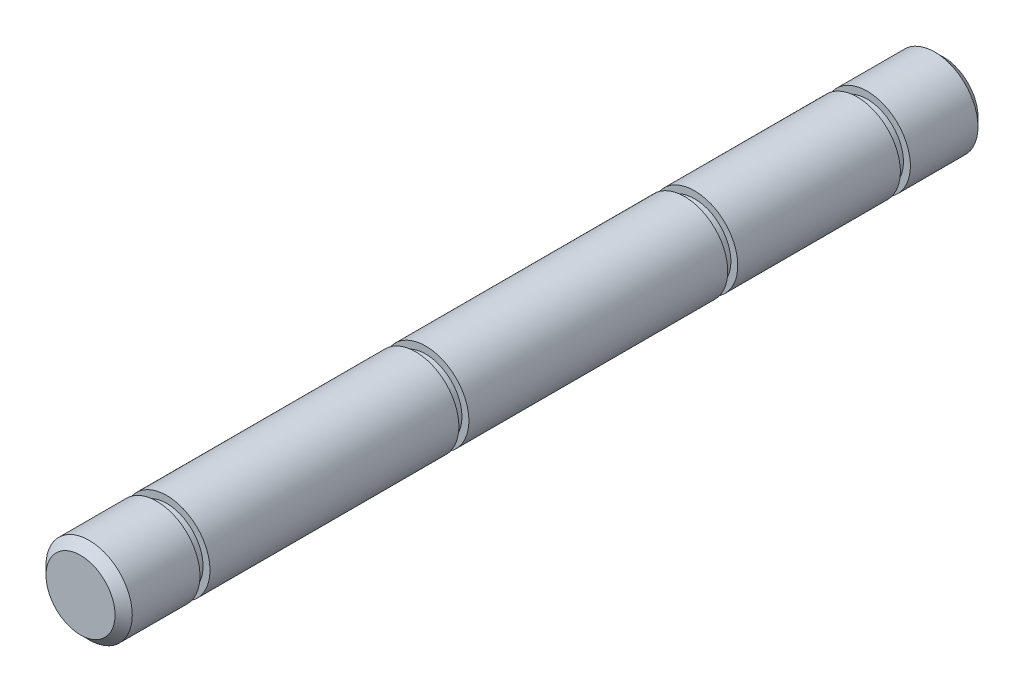
ISO-10303-21;
HEADER;
FILE_DESCRIPTION(('STEP AP214'),'2;1');
FILE_NAME('part.step','',(''),(''),'','','');
FILE_SCHEMA(('AUTOMOTIVE_DESIGN { 1 0 10303 214 1 1 1 1 }'));
ENDSEC;
DATA;
#1=APPLICATION_CONTEXT('core data for automotive mechanical design processes');
#2=APPLICATION_PROTOCOL_DEFINITION('international standard','automotive_design',2000,#1);
#3=PRODUCT_CONTEXT('',#1,'mechanical');
#4=PRODUCT('Part','Part','',(#3));
#5=PRODUCT_RELATED_PRODUCT_CATEGORY('part','',(#4));
#6=PRODUCT_DEFINITION_FORMATION('','',#4);
#7=PRODUCT_DEFINITION_CONTEXT('part definition',#1,'design');
#8=PRODUCT_DEFINITION('design','',#6,#7);
#9=PRODUCT_DEFINITION_SHAPE('','',#8);
#10=(LENGTH_UNIT() NAMED_UNIT(*) SI_UNIT(.MILLI.,.METRE.));
#11=(NAMED_UNIT(*) PLANE_ANGLE_UNIT() SI_UNIT($,.RADIAN.));
#12=(NAMED_UNIT(*) SI_UNIT($,.STERADIAN.) SOLID_ANGLE_UNIT());
#13=UNCERTAINTY_MEASURE_WITH_UNIT(LENGTH_MEASURE(1.E-05),#10,'distance_accuracy_value','');
#14=(GEOMETRIC_REPRESENTATION_CONTEXT(3) GLOBAL_UNCERTAINTY_ASSIGNED_CONTEXT((#13)) GLOBAL_UNIT_ASSIGNED_CONTEXT((#10,
#11,#12)) REPRESENTATION_CONTEXT('',''));
#15=CARTESIAN_POINT('',(0.,0.,0.));
#16=DIRECTION('',(0.,0.,1.));
#17=DIRECTION('',(1.,0.,0.));
#18=AXIS2_PLACEMENT_3D('',#15,#16,#17);
#19=CARTESIAN_POINT('',(0.,0.,63.5));
#20=DIRECTION('',(0.,0.,-1.));
#21=DIRECTION('',(-1.,0.,0.));
#22=AXIS2_PLACEMENT_3D('',#19,#20,#21);
#23=CYLINDRICAL_SURFACE('',#22,3.175);
#24=CARTESIAN_POINT('',(0.,0.,38.1));
#25=DIRECTION('',(0.,0.,-1.));
#26=DIRECTION('',(-1.,0.,0.));
#27=AXIS2_PLACEMENT_3D('',#24,#25,#26);
#28=CIRCLE('',#27,3.175);
#29=CARTESIAN_POINT('',(-3.175,0.,38.1));
#30=VERTEX_POINT('',#29);
#31=EDGE_CURVE('E95',#30,#30,#28,.T.);
#32=ORIENTED_EDGE('',*,*,#31,.T.);
#33=EDGE_LOOP('',(#32));
#34=FACE_BOUND('',#33,.T.);
#35=CARTESIAN_POINT('',(0.,0.,19.05));
#36=DIRECTION('',(0.,0.,-1.));
#37=DIRECTION('',(-1.,0.,0.));
#38=AXIS2_PLACEMENT_3D('',#35,#36,#37);
#39=CIRCLE('',#38,3.175);
#40=CARTESIAN_POINT('',(-3.175,0.,19.05));
#41=VERTEX_POINT('',#40);
#42=EDGE_CURVE('E59',#41,#41,#39,.T.);
#43=ORIENTED_EDGE('',*,*,#42,.F.);
#44=EDGE_LOOP('',(#43));
#45=FACE_BOUND('',#44,.T.);
#46=ADVANCED_FACE('F37',(#34,#45),#23,.T.);
#47=CARTESIAN_POINT('',(0.,0.,18.3134));
#48=DIRECTION('',(0.,0.,-1.));
#49=DIRECTION('',(-1.,0.,0.));
#50=AXIS2_PLACEMENT_3D('',#47,#48,#49);
#51=CIRCLE('',#50,3.175);
#52=CARTESIAN_POINT('',(-3.175,0.,18.3134));
#53=VERTEX_POINT('',#52);
#54=EDGE_CURVE('E58',#53,#53,#51,.T.);
#55=ORIENTED_EDGE('',*,*,#54,.T.);
#56=EDGE_LOOP('',(#55));
#57=FACE_BOUND('',#56,.T.);
#58=CARTESIAN_POINT('',(0.,0.,6.35));
#59=DIRECTION('',(0.,0.,-1.));
#60=DIRECTION('',(-1.,0.,0.));
#61=AXIS2_PLACEMENT_3D('',#58,#59,#60);
#62=CIRCLE('',#61,3.175);
#63=CARTESIAN_POINT('',(-3.175,0.,6.35));
#64=VERTEX_POINT('',#63);
#65=EDGE_CURVE('E71',#64,#64,#62,.T.);
#66=ORIENTED_EDGE('',*,*,#65,.F.);
#67=EDGE_LOOP('',(#66));
#68=FACE_BOUND('',#67,.T.);
#69=ADVANCED_FACE('F131',(#57,#68),#23,.T.);
#70=CARTESIAN_POINT('',(0.,0.,18.3134));
#71=DIRECTION('',(0.,0.,-1.));
#72=DIRECTION('',(-1.,0.,0.));
#73=AXIS2_PLACEMENT_3D('',#70,#71,#72);
#74=PLANE('',#73);
#75=ORIENTED_EDGE('',*,*,#54,.F.);
#76=EDGE_LOOP('',(#75));
#77=FACE_BOUND('',#76,.T.);
#78=CARTESIAN_POINT('',(0.,0.,18.3134));
#79=DIRECTION('',(0.,0.,-1.));
#80=DIRECTION('',(-1.,0.,0.));
#81=AXIS2_PLACEMENT_3D('',#78,#79,#80);
#82=CIRCLE('',#81,2.667);
#83=CARTESIAN_POINT('',(-2.667,0.,18.3134));
#84=VERTEX_POINT('',#83);
#85=EDGE_CURVE('E62',#84,#84,#82,.T.);
#86=ORIENTED_EDGE('',*,*,#85,.T.);
#87=EDGE_LOOP('',(#86));
#88=FACE_BOUND('',#87,.T.);
#89=ADVANCED_FACE('F157',(#77,#88),#74,.F.);
#90=CARTESIAN_POINT('',(0.,0.,19.05));
#91=DIRECTION('',(0.,0.,-1.));
#92=DIRECTION('',(-1.,0.,0.));
#93=AXIS2_PLACEMENT_3D('',#90,#91,#92);
#94=PLANE('',#93);
#95=ORIENTED_EDGE('',*,*,#42,.T.);
#96=EDGE_LOOP('',(#95));
#97=FACE_BOUND('',#96,.T.);
#98=CARTESIAN_POINT('',(0.,0.,19.05));
#99=DIRECTION('',(0.,0.,-1.));
#100=DIRECTION('',(-1.,0.,0.));
#101=AXIS2_PLACEMENT_3D('',#98,#99,#100);
#102=CIRCLE('',#101,2.667);
#103=CARTESIAN_POINT('',(-2.667,0.,19.05));
#104=VERTEX_POINT('',#103);
#105=EDGE_CURVE('E65',#104,#104,#102,.T.);
#106=ORIENTED_EDGE('',*,*,#105,.F.);
#107=EDGE_LOOP('',(#106));
#108=FACE_BOUND('',#107,.T.);
#109=ADVANCED_FACE('F162',(#97,#108),#94,.T.);
#110=CARTESIAN_POINT('',(0.,0.,18.3134));
#111=DIRECTION('',(0.,0.,1.));
#112=DIRECTION('',(1.,0.,0.));
#113=AXIS2_PLACEMENT_3D('',#110,#111,#112);
#114=CYLINDRICAL_SURFACE('',#113,2.667);
#115=ORIENTED_EDGE('',*,*,#85,.F.);
#116=EDGE_LOOP('',(#115));
#117=FACE_BOUND('',#116,.T.);
#118=ORIENTED_EDGE('',*,*,#105,.T.);
#119=EDGE_LOOP('',(#118));
#120=FACE_BOUND('',#119,.T.);
#121=ADVANCED_FACE('F186',(#117,#120),#114,.T.);
#122=CARTESIAN_POINT('',(0.,0.,5.6134));
#123=DIRECTION('',(0.,0.,-1.));
#124=DIRECTION('',(-1.,0.,0.));
#125=AXIS2_PLACEMENT_3D('',#122,#123,#124);
#126=PLANE('',#125);
#127=CARTESIAN_POINT('',(0.,0.,5.6134));
#128=DIRECTION('',(0.,0.,-1.));
#129=DIRECTION('',(-1.,0.,0.));
#130=AXIS2_PLACEMENT_3D('',#127,#128,#129);
#131=CIRCLE('',#130,3.175);
#132=CARTESIAN_POINT('',(-3.175,0.,5.6134));
#133=VERTEX_POINT('',#132);
#134=EDGE_CURVE('E68',#133,#133,#131,.T.);
#135=ORIENTED_EDGE('',*,*,#134,.F.);
#136=EDGE_LOOP('',(#135));
#137=FACE_BOUND('',#136,.T.);
#138=CARTESIAN_POINT('',(0.,0.,5.6134));
#139=DIRECTION('',(0.,0.,-1.));
#140=DIRECTION('',(-1.,0.,0.));
#141=AXIS2_PLACEMENT_3D('',#138,#139,#140);
#142=CIRCLE('',#141,2.667);
#143=CARTESIAN_POINT('',(-2.667,0.,5.6134));
#144=VERTEX_POINT('',#143);
#145=EDGE_CURVE('E74',#144,#144,#142,.T.);
#146=ORIENTED_EDGE('',*,*,#145,.T.);
#147=EDGE_LOOP('',(#146));
#148=FACE_BOUND('',#147,.T.);
#149=ADVANCED_FACE('F173',(#137,#148),#126,.F.);
#150=CARTESIAN_POINT('',(0.,0.,6.35));
#151=DIRECTION('',(0.,0.,-1.));
#152=DIRECTION('',(-1.,0.,0.));
#153=AXIS2_PLACEMENT_3D('',#150,#151,#152);
#154=PLANE('',#153);
#155=ORIENTED_EDGE('',*,*,#65,.T.);
#156=EDGE_LOOP('',(#155));
#157=FACE_BOUND('',#156,.T.);
#158=CARTESIAN_POINT('',(0.,0.,6.35));
#159=DIRECTION('',(0.,0.,-1.));
#160=DIRECTION('',(-1.,0.,0.));
#161=AXIS2_PLACEMENT_3D('',#158,#159,#160);
#162=CIRCLE('',#161,2.667);
#163=CARTESIAN_POINT('',(-2.667,0.,6.35));
#164=VERTEX_POINT('',#163);
#165=EDGE_CURVE('E77',#164,#164,#162,.T.);
#166=ORIENTED_EDGE('',*,*,#165,.F.);
#167=EDGE_LOOP('',(#166));
#168=FACE_BOUND('',#167,.T.);
#169=ADVANCED_FACE('F169',(#157,#168),#154,.T.);
#170=CARTESIAN_POINT('',(0.,0.,5.6134));
#171=DIRECTION('',(0.,0.,1.));
#172=DIRECTION('',(1.,0.,0.));
#173=AXIS2_PLACEMENT_3D('',#170,#171,#172);
#174=CYLINDRICAL_SURFACE('',#173,2.667);
#175=ORIENTED_EDGE('',*,*,#145,.F.);
#176=EDGE_LOOP('',(#175));
#177=FACE_BOUND('',#176,.T.);
#178=ORIENTED_EDGE('',*,*,#165,.T.);
#179=EDGE_LOOP('',(#178));
#180=FACE_BOUND('',#179,.T.);
#181=ADVANCED_FACE('F172',(#177,#180),#174,.T.);
#182=CARTESIAN_POINT('',(0.,0.,0.));
#183=DIRECTION('',(0.,0.,1.));
#184=DIRECTION('',(1.,0.,0.));
#185=AXIS2_PLACEMENT_3D('',#182,#183,#184);
#186=PLANE('',#185);
#187=CARTESIAN_POINT('',(0.,0.,0.));
#188=DIRECTION('',(0.,0.,1.));
#189=DIRECTION('',(1.,0.,0.));
#190=AXIS2_PLACEMENT_3D('',#187,#188,#189);
#191=CIRCLE('',#190,2.54);
#192=CARTESIAN_POINT('',(2.54,0.,0.));
#193=VERTEX_POINT('',#192);
#194=EDGE_CURVE('E45',#193,#193,#191,.F.);
#195=ORIENTED_EDGE('',*,*,#194,.T.);
#196=EDGE_LOOP('',(#195));
#197=FACE_BOUND('',#196,.T.);
#198=ADVANCED_FACE('F140',(#197),#186,.F.);
#199=CARTESIAN_POINT('',(0.,0.,0.634999999999983));
#200=DIRECTION('',(0.,0.,1.));
#201=DIRECTION('',(1.,0.,0.));
#202=AXIS2_PLACEMENT_3D('',#199,#200,#201);
#203=CONICAL_SURFACE('',#202,3.175,0.785398163397461);
#204=CARTESIAN_POINT('',(0.,0.,0.634999999999983));
#205=DIRECTION('',(0.,0.,1.));
#206=DIRECTION('',(1.,0.,0.));
#207=AXIS2_PLACEMENT_3D('',#204,#205,#206);
#208=CIRCLE('',#207,3.175);
#209=CARTESIAN_POINT('',(3.175,0.,0.634999999999983));
#210=VERTEX_POINT('',#209);
#211=EDGE_CURVE('E49',#210,#210,#208,.T.);
#212=CARTESIAN_POINT('',(2.54,0.,0.));
#213=CARTESIAN_POINT('',(2.54661458333333,0.,0.00661458333333316));
#214=CARTESIAN_POINT('',(2.55322916666667,0.,0.0132291666666663));
#215=CARTESIAN_POINT('',(2.56645833333333,0.,0.0264583333333325));
#216=CARTESIAN_POINT('',(2.57307291666667,0.,0.0330729166666656));
#217=CARTESIAN_POINT('',(2.58630208333333,0.,0.0463020833333319));
#218=CARTESIAN_POINT('',(2.59291666666667,0.,0.0529166666666651));
#219=CARTESIAN_POINT('',(2.60614583333333,0.,0.0661458333333314));
#220=CARTESIAN_POINT('',(2.61276041666667,0.,0.0727604166666646));
#221=CARTESIAN_POINT('',(2.62598958333333,0.,0.0859895833333309));
#222=CARTESIAN_POINT('',(2.63260416666667,0.,0.0926041666666641));
#223=CARTESIAN_POINT('',(2.64583333333333,0.,0.10583333333333));
#224=CARTESIAN_POINT('',(2.65244791666667,0.,0.112447916666663));
#225=CARTESIAN_POINT('',(2.66567708333333,0.,0.12567708333333));
#226=CARTESIAN_POINT('',(2.67229166666667,0.,0.132291666666663));
#227=CARTESIAN_POINT('',(2.68552083333333,0.,0.145520833333329));
#228=CARTESIAN_POINT('',(2.69213541666667,0.,0.152135416666662));
#229=CARTESIAN_POINT('',(2.70536458333333,0.,0.165364583333329));
#230=CARTESIAN_POINT('',(2.71197916666667,0.,0.171979166666662));
#231=CARTESIAN_POINT('',(2.72520833333333,0.,0.185208333333328));
#232=CARTESIAN_POINT('',(2.73182291666667,0.,0.191822916666661));
#233=CARTESIAN_POINT('',(2.74505208333333,0.,0.205052083333328));
#234=CARTESIAN_POINT('',(2.75166666666667,0.,0.211666666666661));
#235=CARTESIAN_POINT('',(2.76489583333333,0.,0.224895833333327));
#236=CARTESIAN_POINT('',(2.77151041666667,0.,0.23151041666666));
#237=CARTESIAN_POINT('',(2.78473958333333,0.,0.244739583333327));
#238=CARTESIAN_POINT('',(2.79135416666667,0.,0.25135416666666));
#239=CARTESIAN_POINT('',(2.80458333333333,0.,0.264583333333326));
#240=CARTESIAN_POINT('',(2.81119791666667,0.,0.271197916666659));
#241=CARTESIAN_POINT('',(2.82442708333333,0.,0.284427083333326));
#242=CARTESIAN_POINT('',(2.83104166666667,0.,0.291041666666659));
#243=CARTESIAN_POINT('',(2.84427083333333,0.,0.304270833333325));
#244=CARTESIAN_POINT('',(2.85088541666667,0.,0.310885416666658));
#245=CARTESIAN_POINT('',(2.86411458333333,0.,0.324114583333325));
#246=CARTESIAN_POINT('',(2.87072916666667,0.,0.330729166666658));
#247=CARTESIAN_POINT('',(2.88395833333333,0.,0.343958333333324));
#248=CARTESIAN_POINT('',(2.89057291666667,0.,0.350572916666657));
#249=CARTESIAN_POINT('',(2.90380208333333,0.,0.363802083333323));
#250=CARTESIAN_POINT('',(2.91041666666667,0.,0.370416666666657));
#251=CARTESIAN_POINT('',(2.92364583333333,0.,0.383645833333323));
#252=CARTESIAN_POINT('',(2.93026041666667,0.,0.390260416666656));
#253=CARTESIAN_POINT('',(2.94348958333333,0.,0.403489583333322));
#254=CARTESIAN_POINT('',(2.95010416666667,0.,0.410104166666656));
#255=CARTESIAN_POINT('',(2.96333333333333,0.,0.423333333333322));
#256=CARTESIAN_POINT('',(2.96994791666667,0.,0.429947916666655));
#257=CARTESIAN_POINT('',(2.98317708333333,0.,0.443177083333321));
#258=CARTESIAN_POINT('',(2.98979166666667,0.,0.449791666666655));
#259=CARTESIAN_POINT('',(3.00302083333333,0.,0.463020833333321));
#260=CARTESIAN_POINT('',(3.00963541666667,0.,0.469635416666654));
#261=CARTESIAN_POINT('',(3.02286458333333,0.,0.48286458333332));
#262=CARTESIAN_POINT('',(3.02947916666667,0.,0.489479166666653));
#263=CARTESIAN_POINT('',(3.04270833333333,0.,0.50270833333332));
#264=CARTESIAN_POINT('',(3.04932291666667,0.,0.509322916666653));
#265=CARTESIAN_POINT('',(3.06255208333333,0.,0.522552083333319));
#266=CARTESIAN_POINT('',(3.06916666666667,0.,0.529166666666652));
#267=CARTESIAN_POINT('',(3.08239583333333,0.,0.542395833333319));
#268=CARTESIAN_POINT('',(3.08901041666667,0.,0.549010416666652));
#269=CARTESIAN_POINT('',(3.10223958333333,0.,0.562239583333318));
#270=CARTESIAN_POINT('',(3.10885416666667,0.,0.568854166666651));
#271=CARTESIAN_POINT('',(3.12208333333333,0.,0.582083333333318));
#272=CARTESIAN_POINT('',(3.12869791666667,0.,0.588697916666651));
#273=CARTESIAN_POINT('',(3.14192708333333,0.,0.601927083333317));
#274=CARTESIAN_POINT('',(3.14854166666667,0.,0.60854166666665));
#275=CARTESIAN_POINT('',(3.16177083333333,0.,0.621770833333317));
#276=CARTESIAN_POINT('',(3.16838541666667,0.,0.62838541666665));
#277=CARTESIAN_POINT('',(3.175,0.,0.634999999999983));
#278=B_SPLINE_CURVE_WITH_KNOTS('',3,(#212,#213,#214,#215,#216,#217,#218,#219,#220,#221,#222,
#223,#224,#225,#226,#227,#228,#229,#230,#231,#232,#233,#234,#235,#236,#237,#238,#239,#240,#241,
#242,#243,#244,#245,#246,#247,#248,#249,#250,#251,#252,#253,#254,#255,#256,#257,#258,#259,#260,
#261,#262,#263,#264,#265,#266,#267,#268,#269,#270,#271,#272,#273,#274,#275,#276,#277),
.UNSPECIFIED.,.F.,.F.,(4,2,2,2,2,2,2,2,2,2,2,2,2,2,2,2,2,2,2,2,2,2,2,2,2,2,2,2,2,2,2,2,4),(0.,
0.0280633003783407,0.0561266007566816,0.0841899011350223,0.112253201513363,0.140316501891704,
0.168379802270045,0.196443102648385,0.224506403026726,0.252569703405066,0.280633003783407,
0.308696304161748,0.336759604540089,0.364822904918429,0.39288620529677,0.420949505675111,
0.449012806053451,0.477076106431792,0.505139406810133,0.533202707188473,0.561266007566814,
0.589329307945155,0.617392608323495,0.645455908701836,0.673519209080177,0.701582509458518,
0.729645809836858,0.757709110215199,0.78577241059354,0.81383571097188,0.841899011350221,
0.869962311728562,0.898025612106902),.UNSPECIFIED.);
#279=EDGE_CURVE('BSEAM134',#193,#210,#278,.T.);
#280=ORIENTED_EDGE('',*,*,#194,.F.);
#281=ORIENTED_EDGE('',*,*,#211,.F.);
#282=ORIENTED_EDGE('',*,*,#279,.T.);
#283=ORIENTED_EDGE('',*,*,#279,.F.);
#284=EDGE_LOOP('',(#280,#282,#281,#283));
#285=FACE_BOUND('',#284,.T.);
#286=ADVANCED_FACE('F134',(#285),#203,.T.);
#287=ORIENTED_EDGE('',*,*,#134,.T.);
#288=EDGE_LOOP('',(#287));
#289=FACE_BOUND('',#288,.T.);
#290=ORIENTED_EDGE('',*,*,#211,.T.);
#291=EDGE_LOOP('',(#290));
#292=FACE_BOUND('',#291,.T.);
#293=ADVANCED_FACE('F114',(#289,#292),#23,.T.);
#294=CARTESIAN_POINT('',(0.,0.,38.8366));
#295=DIRECTION('',(0.,0.,-1.));
#296=DIRECTION('',(-1.,0.,0.));
#297=AXIS2_PLACEMENT_3D('',#294,#295,#296);
#298=PLANE('',#297);
#299=CARTESIAN_POINT('',(0.,0.,38.8366));
#300=DIRECTION('',(0.,0.,-1.));
#301=DIRECTION('',(-1.,0.,0.));
#302=AXIS2_PLACEMENT_3D('',#299,#300,#301);
#303=CIRCLE('',#302,2.667);
#304=CARTESIAN_POINT('',(-2.667,0.,38.8366));
#305=VERTEX_POINT('',#304);
#306=EDGE_CURVE('E98',#305,#305,#303,.T.);
#307=ORIENTED_EDGE('',*,*,#306,.F.);
#308=EDGE_LOOP('',(#307));
#309=FACE_BOUND('',#308,.T.);
#310=CARTESIAN_POINT('',(0.,0.,38.8366));
#311=DIRECTION('',(0.,0.,-1.));
#312=DIRECTION('',(-1.,0.,0.));
#313=AXIS2_PLACEMENT_3D('',#310,#311,#312);
#314=CIRCLE('',#313,3.175);
#315=CARTESIAN_POINT('',(-3.175,0.,38.8366));
#316=VERTEX_POINT('',#315);
#317=EDGE_CURVE('E92',#316,#316,#314,.T.);
#318=ORIENTED_EDGE('',*,*,#317,.T.);
#319=EDGE_LOOP('',(#318));
#320=FACE_BOUND('',#319,.T.);
#321=ADVANCED_FACE('F110',(#309,#320),#298,.T.);
#322=CARTESIAN_POINT('',(0.,0.,38.1));
#323=DIRECTION('',(0.,0.,-1.));
#324=DIRECTION('',(-1.,0.,0.));
#325=AXIS2_PLACEMENT_3D('',#322,#323,#324);
#326=PLANE('',#325);
#327=CARTESIAN_POINT('',(0.,0.,38.1));
#328=DIRECTION('',(0.,0.,-1.));
#329=DIRECTION('',(-1.,0.,0.));
#330=AXIS2_PLACEMENT_3D('',#327,#328,#329);
#331=CIRCLE('',#330,2.667);
#332=CARTESIAN_POINT('',(-2.667,0.,38.1));
#333=VERTEX_POINT('',#332);
#334=EDGE_CURVE('E101',#333,#333,#331,.T.);
#335=ORIENTED_EDGE('',*,*,#334,.T.);
#336=EDGE_LOOP('',(#335));
#337=FACE_BOUND('',#336,.T.);
#338=ORIENTED_EDGE('',*,*,#31,.F.);
#339=EDGE_LOOP('',(#338));
#340=FACE_BOUND('',#339,.T.);
#341=ADVANCED_FACE('F113',(#337,#340),#326,.F.);
#342=CARTESIAN_POINT('',(0.,0.,38.8366));
#343=DIRECTION('',(0.,0.,-1.));
#344=DIRECTION('',(-1.,0.,0.));
#345=AXIS2_PLACEMENT_3D('',#342,#343,#344);
#346=CYLINDRICAL_SURFACE('',#345,2.667);
#347=ORIENTED_EDGE('',*,*,#306,.T.);
#348=EDGE_LOOP('',(#347));
#349=FACE_BOUND('',#348,.T.);
#350=ORIENTED_EDGE('',*,*,#334,.F.);
#351=EDGE_LOOP('',(#350));
#352=FACE_BOUND('',#351,.T.);
#353=ADVANCED_FACE('F107',(#349,#352),#346,.T.);
#354=CARTESIAN_POINT('',(0.,0.,63.5));
#355=DIRECTION('',(0.,0.,1.));
#356=DIRECTION('',(1.,0.,0.));
#357=AXIS2_PLACEMENT_3D('',#354,#355,#356);
#358=PLANE('',#357);
#359=CARTESIAN_POINT('',(0.,0.,63.5));
#360=DIRECTION('',(0.,0.,1.));
#361=DIRECTION('',(1.,0.,0.));
#362=AXIS2_PLACEMENT_3D('',#359,#360,#361);
#363=CIRCLE('',#362,2.54000000000001);
#364=CARTESIAN_POINT('',(2.54000000000001,0.,63.5));
#365=VERTEX_POINT('',#364);
#366=EDGE_CURVE('E10',#365,#365,#363,.T.);
#367=ORIENTED_EDGE('',*,*,#366,.T.);
#368=EDGE_LOOP('',(#367));
#369=FACE_BOUND('',#368,.T.);
#370=ADVANCED_FACE('F152',(#369),#358,.T.);
#371=CARTESIAN_POINT('',(0.,0.,63.5));
#372=DIRECTION('',(0.,0.,-1.));
#373=DIRECTION('',(-1.,0.,0.));
#374=AXIS2_PLACEMENT_3D('',#371,#372,#373);
#375=CONICAL_SURFACE('',#374,2.54000000000001,0.785398163397439);
#376=CARTESIAN_POINT('',(0.,0.,62.865));
#377=DIRECTION('',(0.,0.,1.));
#378=DIRECTION('',(1.,0.,0.));
#379=AXIS2_PLACEMENT_3D('',#376,#377,#378);
#380=CIRCLE('',#379,3.175);
#381=CARTESIAN_POINT('',(3.175,0.,62.865));
#382=VERTEX_POINT('',#381);
#383=EDGE_CURVE('E53',#382,#382,#380,.F.);
#384=ORIENTED_EDGE('',*,*,#383,.F.);
#385=EDGE_LOOP('',(#384));
#386=FACE_BOUND('',#385,.T.);
#387=ORIENTED_EDGE('',*,*,#366,.F.);
#388=EDGE_LOOP('',(#387));
#389=FACE_BOUND('',#388,.T.);
#390=ADVANCED_FACE('F40',(#386,#389),#375,.T.);
#391=CARTESIAN_POINT('',(0.,0.,57.8866));
#392=DIRECTION('',(0.,0.,-1.));
#393=DIRECTION('',(-1.,0.,0.));
#394=AXIS2_PLACEMENT_3D('',#391,#392,#393);
#395=CIRCLE('',#394,3.175);
#396=CARTESIAN_POINT('',(-3.175,0.,57.8866));
#397=VERTEX_POINT('',#396);
#398=EDGE_CURVE('E80',#397,#397,#395,.T.);
#399=ORIENTED_EDGE('',*,*,#398,.F.);
#400=EDGE_LOOP('',(#399));
#401=FACE_BOUND('',#400,.T.);
#402=ORIENTED_EDGE('',*,*,#383,.T.);
#403=EDGE_LOOP('',(#402));
#404=FACE_BOUND('',#403,.T.);
#405=ADVANCED_FACE('F136',(#401,#404),#23,.T.);
#406=CARTESIAN_POINT('',(0.,0.,57.8866));
#407=DIRECTION('',(0.,0.,1.));
#408=DIRECTION('',(-1.,0.,0.));
#409=AXIS2_PLACEMENT_3D('',#406,#407,#408);
#410=PLANE('',#409);
#411=CARTESIAN_POINT('',(0.,0.,57.8866));
#412=DIRECTION('',(0.,0.,-1.));
#413=DIRECTION('',(-1.,0.,0.));
#414=AXIS2_PLACEMENT_3D('',#411,#412,#413);
#415=CIRCLE('',#414,2.667);
#416=CARTESIAN_POINT('',(-2.667,0.,57.8866));
#417=VERTEX_POINT('',#416);
#418=EDGE_CURVE('E86',#417,#417,#415,.T.);
#419=ORIENTED_EDGE('',*,*,#418,.F.);
#420=EDGE_LOOP('',(#419));
#421=FACE_BOUND('',#420,.T.);
#422=ORIENTED_EDGE('',*,*,#398,.T.);
#423=EDGE_LOOP('',(#422));
#424=FACE_BOUND('',#423,.T.);
#425=ADVANCED_FACE('F144',(#421,#424),#410,.F.);
#426=CARTESIAN_POINT('',(0.,0.,57.8866));
#427=DIRECTION('',(0.,0.,-1.));
#428=DIRECTION('',(-1.,0.,0.));
#429=AXIS2_PLACEMENT_3D('',#426,#427,#428);
#430=CYLINDRICAL_SURFACE('',#429,2.667);
#431=ORIENTED_EDGE('',*,*,#418,.T.);
#432=EDGE_LOOP('',(#431));
#433=FACE_BOUND('',#432,.T.);
#434=CARTESIAN_POINT('',(0.,0.,57.15));
#435=DIRECTION('',(0.,0.,-1.));
#436=DIRECTION('',(-1.,0.,0.));
#437=AXIS2_PLACEMENT_3D('',#434,#435,#436);
#438=CIRCLE('',#437,2.667);
#439=CARTESIAN_POINT('',(-2.667,0.,57.15));
#440=VERTEX_POINT('',#439);
#441=EDGE_CURVE('E89',#440,#440,#438,.T.);
#442=ORIENTED_EDGE('',*,*,#441,.F.);
#443=EDGE_LOOP('',(#442));
#444=FACE_BOUND('',#443,.T.);
#445=ADVANCED_FACE('F126',(#433,#444),#430,.T.);
#446=CARTESIAN_POINT('',(0.,0.,57.15));
#447=DIRECTION('',(0.,0.,1.));
#448=DIRECTION('',(-1.,0.,0.));
#449=AXIS2_PLACEMENT_3D('',#446,#447,#448);
#450=PLANE('',#449);
#451=ORIENTED_EDGE('',*,*,#441,.T.);
#452=EDGE_LOOP('',(#451));
#453=FACE_BOUND('',#452,.T.);
#454=CARTESIAN_POINT('',(0.,0.,57.15));
#455=DIRECTION('',(0.,0.,-1.));
#456=DIRECTION('',(-1.,0.,0.));
#457=AXIS2_PLACEMENT_3D('',#454,#455,#456);
#458=CIRCLE('',#457,3.175);
#459=CARTESIAN_POINT('',(-3.175,0.,57.15));
#460=VERTEX_POINT('',#459);
#461=EDGE_CURVE('E83',#460,#460,#458,.T.);
#462=ORIENTED_EDGE('',*,*,#461,.F.);
#463=EDGE_LOOP('',(#462));
#464=FACE_BOUND('',#463,.T.);
#465=ADVANCED_FACE('F120',(#453,#464),#450,.T.);
#466=ORIENTED_EDGE('',*,*,#461,.T.);
#467=EDGE_LOOP('',(#466));
#468=FACE_BOUND('',#467,.T.);
#469=ORIENTED_EDGE('',*,*,#317,.F.);
#470=EDGE_LOOP('',(#469));
#471=FACE_BOUND('',#470,.T.);
#472=ADVANCED_FACE('F118',(#468,#471),#23,.T.);
#473=CLOSED_SHELL('',(#46,#69,#89,#109,#121,#149,#169,#181,#198,#286,#293,#321,#341,#353,#370,
#390,#405,#425,#445,#465,#472));
#474=MANIFOLD_SOLID_BREP('B2',#473);
#475=ADVANCED_BREP_SHAPE_REPRESENTATION('',(#18,#474),#14);
#476=SHAPE_DEFINITION_REPRESENTATION(#9,#475);
ENDSEC;
END-ISO-10303-21;
